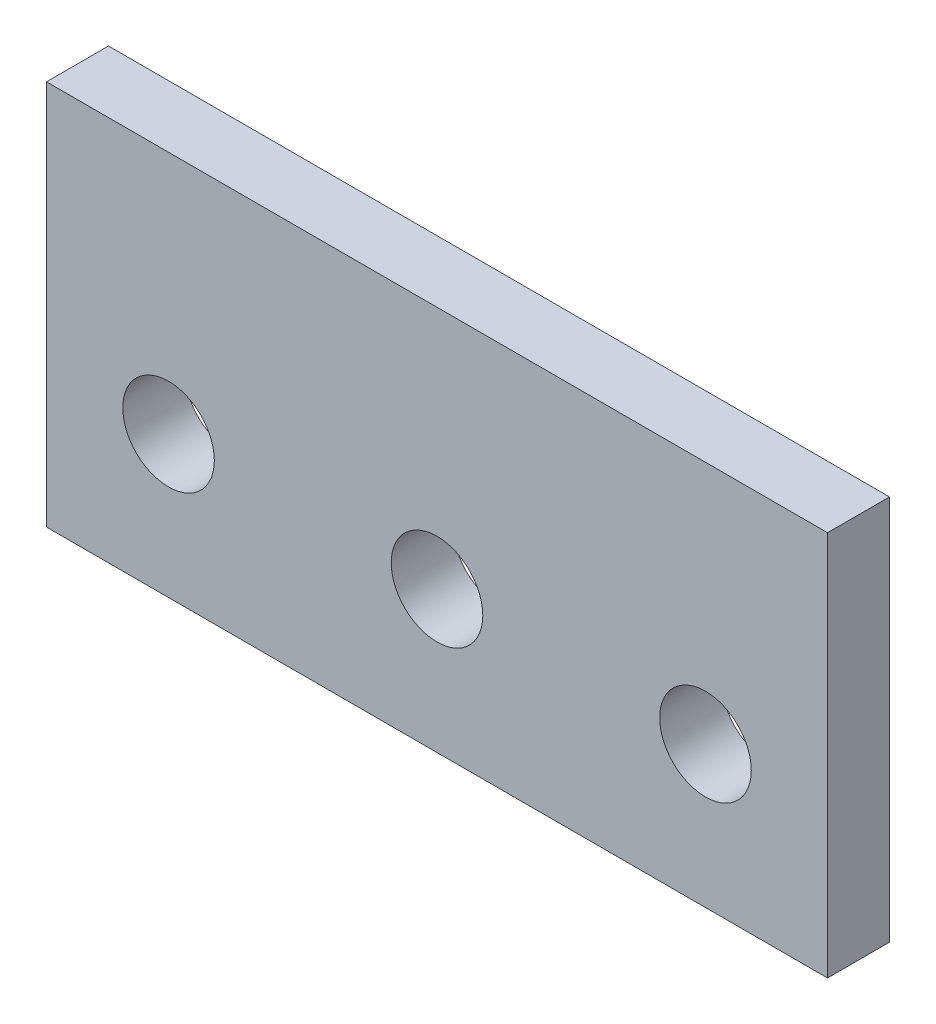
ISO-10303-21;
HEADER;
FILE_DESCRIPTION(('STEP AP214'),'2;1');
FILE_NAME('part.step','',(''),(''),'','','');
FILE_SCHEMA(('AUTOMOTIVE_DESIGN { 1 0 10303 214 1 1 1 1 }'));
ENDSEC;
DATA;
#1=APPLICATION_CONTEXT('core data for automotive mechanical design processes');
#2=APPLICATION_PROTOCOL_DEFINITION('international standard','automotive_design',2000,#1);
#3=PRODUCT_CONTEXT('',#1,'mechanical');
#4=PRODUCT('Part','Part','',(#3));
#5=PRODUCT_RELATED_PRODUCT_CATEGORY('part','',(#4));
#6=PRODUCT_DEFINITION_FORMATION('','',#4);
#7=PRODUCT_DEFINITION_CONTEXT('part definition',#1,'design');
#8=PRODUCT_DEFINITION('design','',#6,#7);
#9=PRODUCT_DEFINITION_SHAPE('','',#8);
#10=(LENGTH_UNIT() NAMED_UNIT(*) SI_UNIT(.MILLI.,.METRE.));
#11=(NAMED_UNIT(*) PLANE_ANGLE_UNIT() SI_UNIT($,.RADIAN.));
#12=(NAMED_UNIT(*) SI_UNIT($,.STERADIAN.) SOLID_ANGLE_UNIT());
#13=UNCERTAINTY_MEASURE_WITH_UNIT(LENGTH_MEASURE(1.E-05),#10,'distance_accuracy_value','');
#14=(GEOMETRIC_REPRESENTATION_CONTEXT(3) GLOBAL_UNCERTAINTY_ASSIGNED_CONTEXT((#13)) GLOBAL_UNIT_ASSIGNED_CONTEXT((#10,
#11,#12)) REPRESENTATION_CONTEXT('',''));
#15=CARTESIAN_POINT('',(0.,0.,0.));
#16=DIRECTION('',(0.,0.,1.));
#17=DIRECTION('',(1.,0.,0.));
#18=AXIS2_PLACEMENT_3D('',#15,#16,#17);
#19=CARTESIAN_POINT('',(0.,0.,25.4));
#20=DIRECTION('',(0.,0.,-1.));
#21=DIRECTION('',(-1.,0.,0.));
#22=AXIS2_PLACEMENT_3D('',#19,#20,#21);
#23=PLANE('',#22);
#24=DIRECTION('',(0.,1.,0.));
#25=VECTOR('',#24,1.);
#26=CARTESIAN_POINT('',(160.,-58.,25.4));
#27=LINE('',#26,#25);
#28=CARTESIAN_POINT('',(160.,-58.,25.4));
#29=VERTEX_POINT('',#28);
#30=CARTESIAN_POINT('',(160.,100.,25.4));
#31=VERTEX_POINT('',#30);
#32=EDGE_CURVE('E85',#29,#31,#27,.T.);
#33=ORIENTED_EDGE('',*,*,#32,.T.);
#34=DIRECTION('',(-1.,0.,0.));
#35=VECTOR('',#34,1.);
#36=CARTESIAN_POINT('',(-160.,100.,25.4));
#37=LINE('',#36,#35);
#38=CARTESIAN_POINT('',(-160.,100.,25.4));
#39=VERTEX_POINT('',#38);
#40=EDGE_CURVE('E80',#31,#39,#37,.T.);
#41=ORIENTED_EDGE('',*,*,#40,.T.);
#42=DIRECTION('',(0.,-1.,0.));
#43=VECTOR('',#42,1.);
#44=CARTESIAN_POINT('',(-160.,-58.,25.4));
#45=LINE('',#44,#43);
#46=CARTESIAN_POINT('',(-160.,-58.,25.4));
#47=VERTEX_POINT('',#46);
#48=EDGE_CURVE('E83',#39,#47,#45,.T.);
#49=ORIENTED_EDGE('',*,*,#48,.T.);
#50=DIRECTION('',(1.,0.,0.));
#51=VECTOR('',#50,1.);
#52=CARTESIAN_POINT('',(-160.,-58.,25.4));
#53=LINE('',#52,#51);
#54=EDGE_CURVE('E50',#47,#29,#53,.T.);
#55=ORIENTED_EDGE('',*,*,#54,.T.);
#56=EDGE_LOOP('',(#33,#41,#49,#55));
#57=FACE_BOUND('',#56,.T.);
#58=CARTESIAN_POINT('',(0.,0.,25.4));
#59=DIRECTION('',(0.,0.,1.));
#60=DIRECTION('',(1.,0.,0.));
#61=AXIS2_PLACEMENT_3D('',#58,#59,#60);
#62=CIRCLE('',#61,18.7647170726698);
#63=CARTESIAN_POINT('',(18.7647170726698,0.,25.4));
#64=VERTEX_POINT('',#63);
#65=EDGE_CURVE('E100',#64,#64,#62,.T.);
#66=ORIENTED_EDGE('',*,*,#65,.F.);
#67=EDGE_LOOP('',(#66));
#68=FACE_BOUND('',#67,.T.);
#69=CARTESIAN_POINT('',(110.,0.,25.4));
#70=DIRECTION('',(0.,0.,1.));
#71=DIRECTION('',(1.,0.,0.));
#72=AXIS2_PLACEMENT_3D('',#69,#70,#71);
#73=CIRCLE('',#72,18.7647170726698);
#74=CARTESIAN_POINT('',(128.76471707267,0.,25.4));
#75=VERTEX_POINT('',#74);
#76=EDGE_CURVE('E115',#75,#75,#73,.T.);
#77=ORIENTED_EDGE('',*,*,#76,.F.);
#78=EDGE_LOOP('',(#77));
#79=FACE_BOUND('',#78,.T.);
#80=CARTESIAN_POINT('',(-110.,-7.68125894545489E-13,25.4));
#81=DIRECTION('',(0.,0.,1.));
#82=DIRECTION('',(1.,0.,0.));
#83=AXIS2_PLACEMENT_3D('',#80,#81,#82);
#84=CIRCLE('',#83,18.7647170726698);
#85=CARTESIAN_POINT('',(-91.2352829273302,-7.68125894545489E-13,25.4));
#86=VERTEX_POINT('',#85);
#87=EDGE_CURVE('E121',#86,#86,#84,.T.);
#88=ORIENTED_EDGE('',*,*,#87,.F.);
#89=EDGE_LOOP('',(#88));
#90=FACE_BOUND('',#89,.T.);
#91=ADVANCED_FACE('F33',(#57,#68,#79,#90),#23,.F.);
#92=CARTESIAN_POINT('',(0.,0.,0.));
#93=DIRECTION('',(0.,0.,-1.));
#94=DIRECTION('',(-1.,0.,0.));
#95=AXIS2_PLACEMENT_3D('',#92,#93,#94);
#96=PLANE('',#95);
#97=CARTESIAN_POINT('',(110.,0.,0.));
#98=DIRECTION('',(0.,0.,1.));
#99=DIRECTION('',(1.,0.,0.));
#100=AXIS2_PLACEMENT_3D('',#97,#98,#99);
#101=CIRCLE('',#100,18.7647170726698);
#102=CARTESIAN_POINT('',(128.76471707267,0.,0.));
#103=VERTEX_POINT('',#102);
#104=EDGE_CURVE('E118',#103,#103,#101,.T.);
#105=ORIENTED_EDGE('',*,*,#104,.T.);
#106=EDGE_LOOP('',(#105));
#107=FACE_BOUND('',#106,.T.);
#108=DIRECTION('',(0.,1.,0.));
#109=VECTOR('',#108,1.);
#110=CARTESIAN_POINT('',(160.,-58.,0.));
#111=LINE('',#110,#109);
#112=CARTESIAN_POINT('',(160.,-58.,0.));
#113=VERTEX_POINT('',#112);
#114=CARTESIAN_POINT('',(160.,100.,0.));
#115=VERTEX_POINT('',#114);
#116=EDGE_CURVE('E97',#113,#115,#111,.T.);
#117=ORIENTED_EDGE('',*,*,#116,.F.);
#118=DIRECTION('',(1.,0.,0.));
#119=VECTOR('',#118,1.);
#120=CARTESIAN_POINT('',(-160.,-58.,0.));
#121=LINE('',#120,#119);
#122=CARTESIAN_POINT('',(-160.,-58.,0.));
#123=VERTEX_POINT('',#122);
#124=EDGE_CURVE('E73',#123,#113,#121,.T.);
#125=ORIENTED_EDGE('',*,*,#124,.F.);
#126=DIRECTION('',(0.,-1.,0.));
#127=VECTOR('',#126,1.);
#128=CARTESIAN_POINT('',(-160.,-58.,0.));
#129=LINE('',#128,#127);
#130=CARTESIAN_POINT('',(-160.,100.,0.));
#131=VERTEX_POINT('',#130);
#132=EDGE_CURVE('E67',#131,#123,#129,.T.);
#133=ORIENTED_EDGE('',*,*,#132,.F.);
#134=DIRECTION('',(-1.,0.,0.));
#135=VECTOR('',#134,1.);
#136=CARTESIAN_POINT('',(-160.,100.,0.));
#137=LINE('',#136,#135);
#138=EDGE_CURVE('E89',#115,#131,#137,.T.);
#139=ORIENTED_EDGE('',*,*,#138,.F.);
#140=EDGE_LOOP('',(#117,#125,#133,#139));
#141=FACE_BOUND('',#140,.T.);
#142=CARTESIAN_POINT('',(0.,0.,0.));
#143=DIRECTION('',(0.,0.,1.));
#144=DIRECTION('',(1.,0.,0.));
#145=AXIS2_PLACEMENT_3D('',#142,#143,#144);
#146=CIRCLE('',#145,18.7647170726698);
#147=CARTESIAN_POINT('',(18.7647170726698,0.,0.));
#148=VERTEX_POINT('',#147);
#149=EDGE_CURVE('E112',#148,#148,#146,.T.);
#150=ORIENTED_EDGE('',*,*,#149,.T.);
#151=EDGE_LOOP('',(#150));
#152=FACE_BOUND('',#151,.T.);
#153=CARTESIAN_POINT('',(-110.,-7.68125894545489E-13,0.));
#154=DIRECTION('',(0.,0.,1.));
#155=DIRECTION('',(1.,0.,0.));
#156=AXIS2_PLACEMENT_3D('',#153,#154,#155);
#157=CIRCLE('',#156,18.7647170726698);
#158=CARTESIAN_POINT('',(-91.2352829273302,-7.68125894545489E-13,0.));
#159=VERTEX_POINT('',#158);
#160=EDGE_CURVE('E124',#159,#159,#157,.T.);
#161=ORIENTED_EDGE('',*,*,#160,.T.);
#162=EDGE_LOOP('',(#161));
#163=FACE_BOUND('',#162,.T.);
#164=ADVANCED_FACE('F108',(#107,#141,#152,#163),#96,.T.);
#165=CARTESIAN_POINT('',(160.,-58.,25.4));
#166=DIRECTION('',(-1.,0.,0.));
#167=DIRECTION('',(0.,0.,1.));
#168=AXIS2_PLACEMENT_3D('',#165,#166,#167);
#169=PLANE('',#168);
#170=ORIENTED_EDGE('',*,*,#116,.T.);
#171=DIRECTION('',(0.,0.,-1.));
#172=VECTOR('',#171,1.);
#173=CARTESIAN_POINT('',(160.,100.,25.4));
#174=LINE('',#173,#172);
#175=EDGE_CURVE('E11',#31,#115,#174,.T.);
#176=ORIENTED_EDGE('',*,*,#175,.F.);
#177=ORIENTED_EDGE('',*,*,#32,.F.);
#178=DIRECTION('',(0.,0.,-1.));
#179=VECTOR('',#178,1.);
#180=CARTESIAN_POINT('',(160.,-58.,25.4));
#181=LINE('',#180,#179);
#182=EDGE_CURVE('E93',#29,#113,#181,.T.);
#183=ORIENTED_EDGE('',*,*,#182,.T.);
#184=EDGE_LOOP('',(#170,#176,#177,#183));
#185=FACE_BOUND('',#184,.T.);
#186=ADVANCED_FACE('F35',(#185),#169,.F.);
#187=CARTESIAN_POINT('',(-160.,100.,25.4));
#188=DIRECTION('',(0.,-1.,0.));
#189=DIRECTION('',(0.,0.,-1.));
#190=AXIS2_PLACEMENT_3D('',#187,#188,#189);
#191=PLANE('',#190);
#192=ORIENTED_EDGE('',*,*,#138,.T.);
#193=DIRECTION('',(0.,0.,-1.));
#194=VECTOR('',#193,1.);
#195=CARTESIAN_POINT('',(-160.,100.,25.4));
#196=LINE('',#195,#194);
#197=EDGE_CURVE('E42',#39,#131,#196,.T.);
#198=ORIENTED_EDGE('',*,*,#197,.F.);
#199=ORIENTED_EDGE('',*,*,#40,.F.);
#200=ORIENTED_EDGE('',*,*,#175,.T.);
#201=EDGE_LOOP('',(#192,#198,#199,#200));
#202=FACE_BOUND('',#201,.T.);
#203=ADVANCED_FACE('F88',(#202),#191,.F.);
#204=CARTESIAN_POINT('',(-160.,-58.,25.4));
#205=DIRECTION('',(1.,0.,0.));
#206=DIRECTION('',(0.,0.,-1.));
#207=AXIS2_PLACEMENT_3D('',#204,#205,#206);
#208=PLANE('',#207);
#209=ORIENTED_EDGE('',*,*,#132,.T.);
#210=DIRECTION('',(0.,0.,-1.));
#211=VECTOR('',#210,1.);
#212=CARTESIAN_POINT('',(-160.,-58.,25.4));
#213=LINE('',#212,#211);
#214=EDGE_CURVE('E90',#47,#123,#213,.T.);
#215=ORIENTED_EDGE('',*,*,#214,.F.);
#216=ORIENTED_EDGE('',*,*,#48,.F.);
#217=ORIENTED_EDGE('',*,*,#197,.T.);
#218=EDGE_LOOP('',(#209,#215,#216,#217));
#219=FACE_BOUND('',#218,.T.);
#220=ADVANCED_FACE('F91',(#219),#208,.F.);
#221=CARTESIAN_POINT('',(-160.,-58.,25.4));
#222=DIRECTION('',(0.,1.,0.));
#223=DIRECTION('',(0.,0.,1.));
#224=AXIS2_PLACEMENT_3D('',#221,#222,#223);
#225=PLANE('',#224);
#226=ORIENTED_EDGE('',*,*,#124,.T.);
#227=ORIENTED_EDGE('',*,*,#182,.F.);
#228=ORIENTED_EDGE('',*,*,#54,.F.);
#229=ORIENTED_EDGE('',*,*,#214,.T.);
#230=EDGE_LOOP('',(#226,#227,#228,#229));
#231=FACE_BOUND('',#230,.T.);
#232=ADVANCED_FACE('F105',(#231),#225,.F.);
#233=CARTESIAN_POINT('',(0.,0.,25.4));
#234=DIRECTION('',(0.,0.,-1.));
#235=DIRECTION('',(-1.,0.,0.));
#236=AXIS2_PLACEMENT_3D('',#233,#234,#235);
#237=CYLINDRICAL_SURFACE('',#236,18.7647170726698);
#238=ORIENTED_EDGE('',*,*,#65,.T.);
#239=EDGE_LOOP('',(#238));
#240=FACE_BOUND('',#239,.T.);
#241=ORIENTED_EDGE('',*,*,#149,.F.);
#242=EDGE_LOOP('',(#241));
#243=FACE_BOUND('',#242,.T.);
#244=ADVANCED_FACE('F141',(#240,#243),#237,.F.);
#245=CARTESIAN_POINT('',(110.,0.,25.4));
#246=DIRECTION('',(0.,0.,-1.));
#247=DIRECTION('',(-1.,0.,0.));
#248=AXIS2_PLACEMENT_3D('',#245,#246,#247);
#249=CYLINDRICAL_SURFACE('',#248,18.7647170726698);
#250=ORIENTED_EDGE('',*,*,#76,.T.);
#251=EDGE_LOOP('',(#250));
#252=FACE_BOUND('',#251,.T.);
#253=ORIENTED_EDGE('',*,*,#104,.F.);
#254=EDGE_LOOP('',(#253));
#255=FACE_BOUND('',#254,.T.);
#256=ADVANCED_FACE('F187',(#252,#255),#249,.F.);
#257=CARTESIAN_POINT('',(-110.,-7.68125894545489E-13,25.4));
#258=DIRECTION('',(0.,0.,-1.));
#259=DIRECTION('',(-1.,0.,0.));
#260=AXIS2_PLACEMENT_3D('',#257,#258,#259);
#261=CYLINDRICAL_SURFACE('',#260,18.7647170726698);
#262=ORIENTED_EDGE('',*,*,#87,.T.);
#263=EDGE_LOOP('',(#262));
#264=FACE_BOUND('',#263,.T.);
#265=ORIENTED_EDGE('',*,*,#160,.F.);
#266=EDGE_LOOP('',(#265));
#267=FACE_BOUND('',#266,.T.);
#268=ADVANCED_FACE('F130',(#264,#267),#261,.F.);
#269=CLOSED_SHELL('',(#91,#164,#186,#203,#220,#232,#244,#256,#268));
#270=MANIFOLD_SOLID_BREP('B2',#269);
#271=ADVANCED_BREP_SHAPE_REPRESENTATION('',(#18,#270),#14);
#272=SHAPE_DEFINITION_REPRESENTATION(#9,#271);
ENDSEC;
END-ISO-10303-21;
